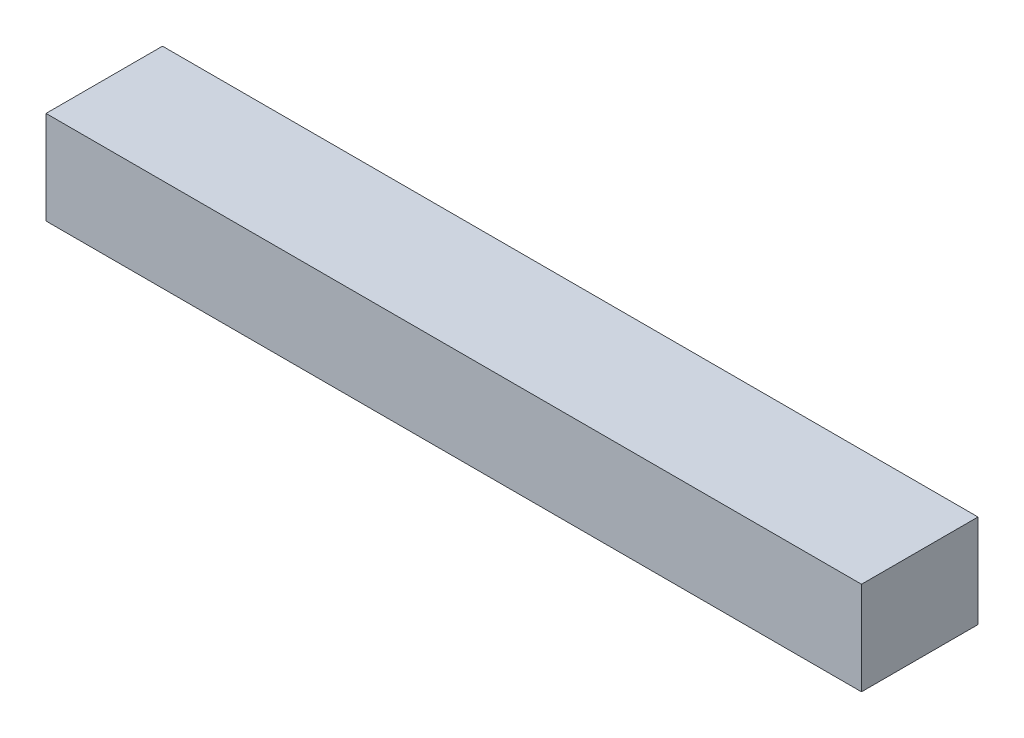
ISO-10303-21;
HEADER;
FILE_DESCRIPTION(('STEP AP214'),'2;1');
FILE_NAME('part.step','',(''),(''),'','','');
FILE_SCHEMA(('AUTOMOTIVE_DESIGN { 1 0 10303 214 1 1 1 1 }'));
ENDSEC;
DATA;
#1=APPLICATION_CONTEXT('core data for automotive mechanical design processes');
#2=APPLICATION_PROTOCOL_DEFINITION('international standard','automotive_design',2000,#1);
#3=PRODUCT_CONTEXT('',#1,'mechanical');
#4=PRODUCT('Part','Part','',(#3));
#5=PRODUCT_RELATED_PRODUCT_CATEGORY('part','',(#4));
#6=PRODUCT_DEFINITION_FORMATION('','',#4);
#7=PRODUCT_DEFINITION_CONTEXT('part definition',#1,'design');
#8=PRODUCT_DEFINITION('design','',#6,#7);
#9=PRODUCT_DEFINITION_SHAPE('','',#8);
#10=(LENGTH_UNIT() NAMED_UNIT(*) SI_UNIT(.MILLI.,.METRE.));
#11=(NAMED_UNIT(*) PLANE_ANGLE_UNIT() SI_UNIT($,.RADIAN.));
#12=(NAMED_UNIT(*) SI_UNIT($,.STERADIAN.) SOLID_ANGLE_UNIT());
#13=UNCERTAINTY_MEASURE_WITH_UNIT(LENGTH_MEASURE(1.E-05),#10,'distance_accuracy_value','');
#14=(GEOMETRIC_REPRESENTATION_CONTEXT(3) GLOBAL_UNCERTAINTY_ASSIGNED_CONTEXT((#13)) GLOBAL_UNIT_ASSIGNED_CONTEXT((#10,
#11,#12)) REPRESENTATION_CONTEXT('',''));
#15=CARTESIAN_POINT('',(0.,0.,0.));
#16=DIRECTION('',(0.,0.,1.));
#17=DIRECTION('',(1.,0.,0.));
#18=AXIS2_PLACEMENT_3D('',#15,#16,#17);
#19=CARTESIAN_POINT('',(70.,0.,0.));
#20=DIRECTION('',(0.,0.,-1.));
#21=DIRECTION('',(0.,1.,0.));
#22=AXIS2_PLACEMENT_3D('',#19,#20,#21);
#23=PLANE('',#22);
#24=DIRECTION('',(0.,-1.,0.));
#25=VECTOR('',#24,1.);
#26=CARTESIAN_POINT('',(0.,0.,0.));
#27=LINE('',#26,#25);
#28=CARTESIAN_POINT('',(0.,8.,0.));
#29=VERTEX_POINT('',#28);
#30=CARTESIAN_POINT('',(0.,0.,0.));
#31=VERTEX_POINT('',#30);
#32=EDGE_CURVE('E113',#29,#31,#27,.T.);
#33=ORIENTED_EDGE('',*,*,#32,.T.);
#34=DIRECTION('',(-1.,0.,0.));
#35=VECTOR('',#34,1.);
#36=CARTESIAN_POINT('',(70.,0.,0.));
#37=LINE('',#36,#35);
#38=CARTESIAN_POINT('',(70.,0.,0.));
#39=VERTEX_POINT('',#38);
#40=EDGE_CURVE('E11',#39,#31,#37,.T.);
#41=ORIENTED_EDGE('',*,*,#40,.F.);
#42=DIRECTION('',(0.,-1.,0.));
#43=VECTOR('',#42,1.);
#44=CARTESIAN_POINT('',(70.,0.,0.));
#45=LINE('',#44,#43);
#46=CARTESIAN_POINT('',(70.,8.,0.));
#47=VERTEX_POINT('',#46);
#48=EDGE_CURVE('E97',#47,#39,#45,.T.);
#49=ORIENTED_EDGE('',*,*,#48,.F.);
#50=DIRECTION('',(-1.,0.,0.));
#51=VECTOR('',#50,1.);
#52=CARTESIAN_POINT('',(70.,8.,0.));
#53=LINE('',#52,#51);
#54=EDGE_CURVE('E109',#47,#29,#53,.T.);
#55=ORIENTED_EDGE('',*,*,#54,.T.);
#56=EDGE_LOOP('',(#33,#41,#49,#55));
#57=FACE_BOUND('',#56,.T.);
#58=ADVANCED_FACE('F45',(#57),#23,.F.);
#59=CARTESIAN_POINT('',(70.,0.,0.));
#60=DIRECTION('',(0.,1.,0.));
#61=DIRECTION('',(0.,0.,1.));
#62=AXIS2_PLACEMENT_3D('',#59,#60,#61);
#63=PLANE('',#62);
#64=DIRECTION('',(0.,0.,-1.));
#65=VECTOR('',#64,1.);
#66=CARTESIAN_POINT('',(0.,0.,0.));
#67=LINE('',#66,#65);
#68=CARTESIAN_POINT('',(0.,0.,-10.));
#69=VERTEX_POINT('',#68);
#70=EDGE_CURVE('E102',#31,#69,#67,.T.);
#71=ORIENTED_EDGE('',*,*,#70,.T.);
#72=DIRECTION('',(-1.,0.,0.));
#73=VECTOR('',#72,1.);
#74=CARTESIAN_POINT('',(70.,0.,-10.));
#75=LINE('',#74,#73);
#76=CARTESIAN_POINT('',(70.,0.,-10.));
#77=VERTEX_POINT('',#76);
#78=EDGE_CURVE('E54',#77,#69,#75,.T.);
#79=ORIENTED_EDGE('',*,*,#78,.F.);
#80=DIRECTION('',(0.,0.,-1.));
#81=VECTOR('',#80,1.);
#82=CARTESIAN_POINT('',(70.,0.,0.));
#83=LINE('',#82,#81);
#84=EDGE_CURVE('E92',#39,#77,#83,.T.);
#85=ORIENTED_EDGE('',*,*,#84,.F.);
#86=ORIENTED_EDGE('',*,*,#40,.T.);
#87=EDGE_LOOP('',(#71,#79,#85,#86));
#88=FACE_BOUND('',#87,.T.);
#89=ADVANCED_FACE('F101',(#88),#63,.F.);
#90=CARTESIAN_POINT('',(70.,0.,-10.));
#91=DIRECTION('',(0.,0.,1.));
#92=DIRECTION('',(0.,-1.,0.));
#93=AXIS2_PLACEMENT_3D('',#90,#91,#92);
#94=PLANE('',#93);
#95=DIRECTION('',(0.,1.,0.));
#96=VECTOR('',#95,1.);
#97=CARTESIAN_POINT('',(0.,0.,-10.));
#98=LINE('',#97,#96);
#99=CARTESIAN_POINT('',(0.,8.,-10.));
#100=VERTEX_POINT('',#99);
#101=EDGE_CURVE('E79',#69,#100,#98,.T.);
#102=ORIENTED_EDGE('',*,*,#101,.T.);
#103=DIRECTION('',(-1.,0.,0.));
#104=VECTOR('',#103,1.);
#105=CARTESIAN_POINT('',(70.,8.,-10.));
#106=LINE('',#105,#104);
#107=CARTESIAN_POINT('',(70.,8.,-10.));
#108=VERTEX_POINT('',#107);
#109=EDGE_CURVE('E104',#108,#100,#106,.T.);
#110=ORIENTED_EDGE('',*,*,#109,.F.);
#111=DIRECTION('',(0.,1.,0.));
#112=VECTOR('',#111,1.);
#113=CARTESIAN_POINT('',(70.,0.,-10.));
#114=LINE('',#113,#112);
#115=EDGE_CURVE('E95',#77,#108,#114,.T.);
#116=ORIENTED_EDGE('',*,*,#115,.F.);
#117=ORIENTED_EDGE('',*,*,#78,.T.);
#118=EDGE_LOOP('',(#102,#110,#116,#117));
#119=FACE_BOUND('',#118,.T.);
#120=ADVANCED_FACE('F105',(#119),#94,.F.);
#121=CARTESIAN_POINT('',(70.,8.,0.));
#122=DIRECTION('',(0.,-1.,0.));
#123=DIRECTION('',(0.,0.,-1.));
#124=AXIS2_PLACEMENT_3D('',#121,#122,#123);
#125=PLANE('',#124);
#126=DIRECTION('',(0.,0.,1.));
#127=VECTOR('',#126,1.);
#128=CARTESIAN_POINT('',(0.,8.,0.));
#129=LINE('',#128,#127);
#130=EDGE_CURVE('E85',#100,#29,#129,.T.);
#131=ORIENTED_EDGE('',*,*,#130,.T.);
#132=ORIENTED_EDGE('',*,*,#54,.F.);
#133=DIRECTION('',(0.,0.,1.));
#134=VECTOR('',#133,1.);
#135=CARTESIAN_POINT('',(70.,8.,0.));
#136=LINE('',#135,#134);
#137=EDGE_CURVE('E62',#108,#47,#136,.T.);
#138=ORIENTED_EDGE('',*,*,#137,.F.);
#139=ORIENTED_EDGE('',*,*,#109,.T.);
#140=EDGE_LOOP('',(#131,#132,#138,#139));
#141=FACE_BOUND('',#140,.T.);
#142=ADVANCED_FACE('F126',(#141),#125,.F.);
#143=CARTESIAN_POINT('',(70.,0.,0.));
#144=DIRECTION('',(-1.,0.,0.));
#145=DIRECTION('',(0.,0.,1.));
#146=AXIS2_PLACEMENT_3D('',#143,#144,#145);
#147=PLANE('',#146);
#148=ORIENTED_EDGE('',*,*,#48,.T.);
#149=ORIENTED_EDGE('',*,*,#84,.T.);
#150=ORIENTED_EDGE('',*,*,#115,.T.);
#151=ORIENTED_EDGE('',*,*,#137,.T.);
#152=EDGE_LOOP('',(#148,#149,#150,#151));
#153=FACE_BOUND('',#152,.T.);
#154=ADVANCED_FACE('F93',(#153),#147,.F.);
#155=CARTESIAN_POINT('',(0.,0.,0.));
#156=DIRECTION('',(-1.,0.,0.));
#157=DIRECTION('',(0.,0.,1.));
#158=AXIS2_PLACEMENT_3D('',#155,#156,#157);
#159=PLANE('',#158);
#160=ORIENTED_EDGE('',*,*,#32,.F.);
#161=ORIENTED_EDGE('',*,*,#130,.F.);
#162=ORIENTED_EDGE('',*,*,#101,.F.);
#163=ORIENTED_EDGE('',*,*,#70,.F.);
#164=EDGE_LOOP('',(#160,#161,#162,#163));
#165=FACE_BOUND('',#164,.T.);
#166=ADVANCED_FACE('F129',(#165),#159,.T.);
#167=CLOSED_SHELL('',(#58,#89,#120,#142,#154,#166));
#168=MANIFOLD_SOLID_BREP('B2',#167);
#169=ADVANCED_BREP_SHAPE_REPRESENTATION('',(#18,#168),#14);
#170=SHAPE_DEFINITION_REPRESENTATION(#9,#169);
ENDSEC;
END-ISO-10303-21;
